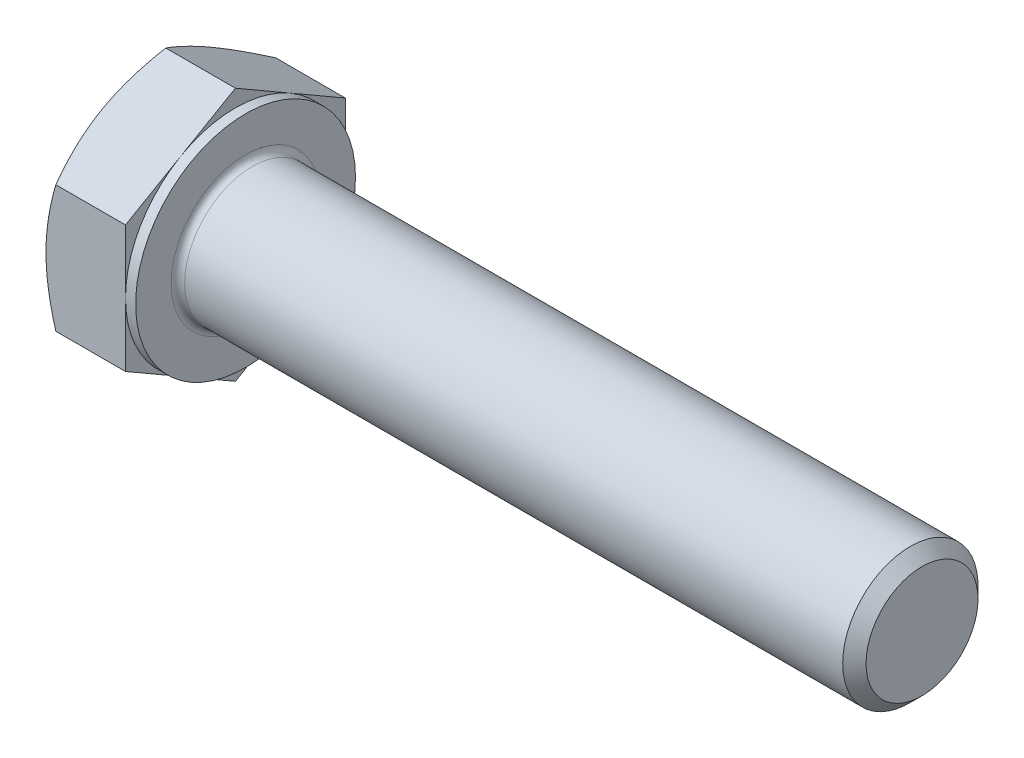
ISO-10303-21;
HEADER;
FILE_DESCRIPTION(('STEP AP214'),'2;1');
FILE_NAME('part.step','',(''),(''),'','','');
FILE_SCHEMA(('AUTOMOTIVE_DESIGN { 1 0 10303 214 1 1 1 1 }'));
ENDSEC;
DATA;
#1=APPLICATION_CONTEXT('core data for automotive mechanical design processes');
#2=APPLICATION_PROTOCOL_DEFINITION('international standard','automotive_design',2000,#1);
#3=PRODUCT_CONTEXT('',#1,'mechanical');
#4=PRODUCT('Part','Part','',(#3));
#5=PRODUCT_RELATED_PRODUCT_CATEGORY('part','',(#4));
#6=PRODUCT_DEFINITION_FORMATION('','',#4);
#7=PRODUCT_DEFINITION_CONTEXT('part definition',#1,'design');
#8=PRODUCT_DEFINITION('design','',#6,#7);
#9=PRODUCT_DEFINITION_SHAPE('','',#8);
#10=(LENGTH_UNIT() NAMED_UNIT(*) SI_UNIT(.MILLI.,.METRE.));
#11=(NAMED_UNIT(*) PLANE_ANGLE_UNIT() SI_UNIT($,.RADIAN.));
#12=(NAMED_UNIT(*) SI_UNIT($,.STERADIAN.) SOLID_ANGLE_UNIT());
#13=UNCERTAINTY_MEASURE_WITH_UNIT(LENGTH_MEASURE(1.E-05),#10,'distance_accuracy_value','');
#14=(GEOMETRIC_REPRESENTATION_CONTEXT(3) GLOBAL_UNCERTAINTY_ASSIGNED_CONTEXT((#13)) GLOBAL_UNIT_ASSIGNED_CONTEXT((#10,
#11,#12)) REPRESENTATION_CONTEXT('',''));
#15=CARTESIAN_POINT('',(0.,0.,0.));
#16=DIRECTION('',(0.,0.,1.));
#17=DIRECTION('',(1.,0.,0.));
#18=AXIS2_PLACEMENT_3D('',#15,#16,#17);
#19=CARTESIAN_POINT('',(5.3,7.50555349946514,0.));
#20=DIRECTION('',(1.,0.,0.));
#21=DIRECTION('',(0.,0.,-1.));
#22=AXIS2_PLACEMENT_3D('',#19,#20,#21);
#23=PLANE('',#22);
#24=CARTESIAN_POINT('',(5.3,0.,0.));
#25=DIRECTION('',(1.,0.,0.));
#26=DIRECTION('',(0.,0.,-1.));
#27=AXIS2_PLACEMENT_3D('',#24,#25,#26);
#28=CIRCLE('',#27,4.4);
#29=CARTESIAN_POINT('',(5.3,0.,-4.4));
#30=VERTEX_POINT('',#29);
#31=EDGE_CURVE('E44',#30,#30,#28,.F.);
#32=ORIENTED_EDGE('',*,*,#31,.T.);
#33=EDGE_LOOP('',(#32));
#34=FACE_BOUND('',#33,.T.);
#35=CARTESIAN_POINT('',(5.3,0.,0.));
#36=DIRECTION('',(1.,0.,0.));
#37=DIRECTION('',(0.,0.,-1.));
#38=AXIS2_PLACEMENT_3D('',#35,#36,#37);
#39=CIRCLE('',#38,6.5);
#40=CARTESIAN_POINT('',(5.3,0.,-6.5));
#41=VERTEX_POINT('',#40);
#42=EDGE_CURVE('E301',#41,#41,#39,.T.);
#43=ORIENTED_EDGE('',*,*,#42,.T.);
#44=EDGE_LOOP('',(#43));
#45=FACE_BOUND('',#44,.T.);
#46=ADVANCED_FACE('F36',(#34,#45),#23,.T.);
#47=CARTESIAN_POINT('',(0.,0.,0.));
#48=DIRECTION('',(-1.,0.,0.));
#49=DIRECTION('',(0.,0.,1.));
#50=AXIS2_PLACEMENT_3D('',#47,#48,#49);
#51=CYLINDRICAL_SURFACE('',#50,4.);
#52=CARTESIAN_POINT('',(5.7,0.,0.));
#53=DIRECTION('',(1.,0.,0.));
#54=DIRECTION('',(0.,0.,-1.));
#55=AXIS2_PLACEMENT_3D('',#52,#53,#54);
#56=CIRCLE('',#55,4.);
#57=CARTESIAN_POINT('',(5.7,0.,-4.));
#58=VERTEX_POINT('',#57);
#59=EDGE_CURVE('E11',#58,#58,#56,.T.);
#60=ORIENTED_EDGE('',*,*,#59,.T.);
#61=EDGE_LOOP('',(#60));
#62=FACE_BOUND('',#61,.T.);
#63=CARTESIAN_POINT('',(44.6095,0.,0.));
#64=DIRECTION('',(-1.,0.,0.));
#65=DIRECTION('',(0.,0.,1.));
#66=AXIS2_PLACEMENT_3D('',#63,#64,#65);
#67=CIRCLE('',#66,4.);
#68=CARTESIAN_POINT('',(44.6095,0.,4.));
#69=VERTEX_POINT('',#68);
#70=EDGE_CURVE('E280',#69,#69,#67,.T.);
#71=ORIENTED_EDGE('',*,*,#70,.T.);
#72=EDGE_LOOP('',(#71));
#73=FACE_BOUND('',#72,.T.);
#74=ADVANCED_FACE('F254',(#62,#73),#51,.T.);
#75=CARTESIAN_POINT('',(45.3,0.,0.));
#76=DIRECTION('',(-1.,0.,0.));
#77=DIRECTION('',(0.,0.,1.));
#78=AXIS2_PLACEMENT_3D('',#75,#76,#77);
#79=CONICAL_SURFACE('',#78,3.3095,0.785398163397436);
#80=ORIENTED_EDGE('',*,*,#70,.F.);
#81=EDGE_LOOP('',(#80));
#82=FACE_BOUND('',#81,.T.);
#83=CARTESIAN_POINT('',(45.3,0.,0.));
#84=DIRECTION('',(-1.,0.,0.));
#85=DIRECTION('',(0.,0.,1.));
#86=AXIS2_PLACEMENT_3D('',#83,#84,#85);
#87=CIRCLE('',#86,3.3095);
#88=CARTESIAN_POINT('',(45.3,0.,3.3095));
#89=VERTEX_POINT('',#88);
#90=EDGE_CURVE('E278',#89,#89,#87,.T.);
#91=ORIENTED_EDGE('',*,*,#90,.T.);
#92=EDGE_LOOP('',(#91));
#93=FACE_BOUND('',#92,.T.);
#94=ADVANCED_FACE('F259',(#82,#93),#79,.T.);
#95=CARTESIAN_POINT('',(45.3,0.,0.));
#96=DIRECTION('',(-1.,0.,0.));
#97=DIRECTION('',(0.,0.,1.));
#98=AXIS2_PLACEMENT_3D('',#95,#96,#97);
#99=PLANE('',#98);
#100=ORIENTED_EDGE('',*,*,#90,.F.);
#101=EDGE_LOOP('',(#100));
#102=FACE_BOUND('',#101,.T.);
#103=ADVANCED_FACE('F266',(#102),#99,.F.);
#104=CARTESIAN_POINT('',(4.7,6.5,0.));
#105=DIRECTION('',(1.,0.,0.));
#106=DIRECTION('',(0.,0.,-1.));
#107=AXIS2_PLACEMENT_3D('',#104,#105,#106);
#108=PLANE('',#107);
#109=DIRECTION('',(0.,0.500000000000001,0.866025403784438));
#110=VECTOR('',#109,1.);
#111=CARTESIAN_POINT('',(4.7,3.75277674973256,-6.5));
#112=LINE('',#111,#110);
#113=CARTESIAN_POINT('',(4.7,3.75277674973256,-6.5));
#114=VERTEX_POINT('',#113);
#115=CARTESIAN_POINT('',(4.7,5.62916512459885,-3.25000000000001));
#116=VERTEX_POINT('',#115);
#117=EDGE_CURVE('E168',#114,#116,#112,.T.);
#118=ORIENTED_EDGE('',*,*,#117,.T.);
#119=CARTESIAN_POINT('',(4.7,0.,0.));
#120=DIRECTION('',(-1.,0.,0.));
#121=DIRECTION('',(0.,0.,1.));
#122=AXIS2_PLACEMENT_3D('',#119,#120,#121);
#123=CIRCLE('',#122,6.5);
#124=CARTESIAN_POINT('',(4.7,0.,-6.5));
#125=VERTEX_POINT('',#124);
#126=EDGE_CURVE('E51',#116,#125,#123,.T.);
#127=ORIENTED_EDGE('',*,*,#126,.T.);
#128=DIRECTION('',(0.,1.,0.));
#129=VECTOR('',#128,1.);
#130=CARTESIAN_POINT('',(4.7,3.75277674973256,-6.5));
#131=LINE('',#130,#129);
#132=EDGE_CURVE('E304',#125,#114,#131,.T.);
#133=ORIENTED_EDGE('',*,*,#132,.T.);
#134=EDGE_LOOP('',(#118,#127,#133));
#135=FACE_BOUND('',#134,.T.);
#136=ADVANCED_FACE('F269',(#135),#108,.T.);
#137=CARTESIAN_POINT('',(4.7,7.50555349946514,0.));
#138=VERTEX_POINT('',#137);
#139=EDGE_CURVE('E166',#116,#138,#112,.T.);
#140=ORIENTED_EDGE('',*,*,#139,.T.);
#141=DIRECTION('',(0.,-0.500000000000001,0.866025403784438));
#142=VECTOR('',#141,1.);
#143=CARTESIAN_POINT('',(4.7,7.50555349946514,0.));
#144=LINE('',#143,#142);
#145=CARTESIAN_POINT('',(4.7,5.62916512459885,3.25000000000001));
#146=VERTEX_POINT('',#145);
#147=EDGE_CURVE('E165',#138,#146,#144,.T.);
#148=ORIENTED_EDGE('',*,*,#147,.T.);
#149=EDGE_CURVE('E154',#146,#116,#123,.T.);
#150=ORIENTED_EDGE('',*,*,#149,.T.);
#151=EDGE_LOOP('',(#140,#148,#150));
#152=FACE_BOUND('',#151,.T.);
#153=ADVANCED_FACE('F274',(#152),#108,.T.);
#154=CARTESIAN_POINT('',(4.7,3.75277674973256,6.5));
#155=VERTEX_POINT('',#154);
#156=EDGE_CURVE('E133',#146,#155,#144,.T.);
#157=ORIENTED_EDGE('',*,*,#156,.T.);
#158=DIRECTION('',(0.,-1.,0.));
#159=VECTOR('',#158,1.);
#160=CARTESIAN_POINT('',(4.7,3.75277674973256,6.5));
#161=LINE('',#160,#159);
#162=CARTESIAN_POINT('',(4.7,0.,6.5));
#163=VERTEX_POINT('',#162);
#164=EDGE_CURVE('E127',#155,#163,#161,.T.);
#165=ORIENTED_EDGE('',*,*,#164,.T.);
#166=EDGE_CURVE('E131',#163,#146,#123,.T.);
#167=ORIENTED_EDGE('',*,*,#166,.T.);
#168=EDGE_LOOP('',(#157,#165,#167));
#169=FACE_BOUND('',#168,.T.);
#170=ADVANCED_FACE('F129',(#169),#108,.T.);
#171=CARTESIAN_POINT('',(4.7,-3.75277674973256,6.5));
#172=VERTEX_POINT('',#171);
#173=EDGE_CURVE('E137',#163,#172,#161,.T.);
#174=ORIENTED_EDGE('',*,*,#173,.T.);
#175=DIRECTION('',(0.,-0.500000000000002,-0.866025403784437));
#176=VECTOR('',#175,1.);
#177=CARTESIAN_POINT('',(4.7,-7.50555349946515,0.));
#178=LINE('',#177,#176);
#179=CARTESIAN_POINT('',(4.7,-5.62916512459884,3.25000000000001));
#180=VERTEX_POINT('',#179);
#181=EDGE_CURVE('E144',#172,#180,#178,.T.);
#182=ORIENTED_EDGE('',*,*,#181,.T.);
#183=EDGE_CURVE('E141',#180,#163,#123,.T.);
#184=ORIENTED_EDGE('',*,*,#183,.T.);
#185=EDGE_LOOP('',(#174,#182,#184));
#186=FACE_BOUND('',#185,.T.);
#187=ADVANCED_FACE('F142',(#186),#108,.T.);
#188=CARTESIAN_POINT('',(4.7,-7.50555349946515,0.));
#189=VERTEX_POINT('',#188);
#190=EDGE_CURVE('E160',#180,#189,#178,.T.);
#191=ORIENTED_EDGE('',*,*,#190,.T.);
#192=DIRECTION('',(0.,0.500000000000001,-0.866025403784438));
#193=VECTOR('',#192,1.);
#194=CARTESIAN_POINT('',(4.7,-3.75277674973258,-6.5));
#195=LINE('',#194,#193);
#196=CARTESIAN_POINT('',(4.7,-5.62916512459885,-3.25000000000001));
#197=VERTEX_POINT('',#196);
#198=EDGE_CURVE('E342',#189,#197,#195,.T.);
#199=ORIENTED_EDGE('',*,*,#198,.T.);
#200=EDGE_CURVE('E148',#197,#180,#123,.T.);
#201=ORIENTED_EDGE('',*,*,#200,.T.);
#202=EDGE_LOOP('',(#191,#199,#201));
#203=FACE_BOUND('',#202,.T.);
#204=ADVANCED_FACE('F343',(#203),#108,.T.);
#205=CARTESIAN_POINT('',(4.7,-3.75277674973258,-6.5));
#206=VERTEX_POINT('',#205);
#207=EDGE_CURVE('E155',#197,#206,#195,.T.);
#208=ORIENTED_EDGE('',*,*,#207,.T.);
#209=EDGE_CURVE('E305',#206,#125,#131,.T.);
#210=ORIENTED_EDGE('',*,*,#209,.T.);
#211=EDGE_CURVE('E312',#125,#197,#123,.T.);
#212=ORIENTED_EDGE('',*,*,#211,.T.);
#213=EDGE_LOOP('',(#208,#210,#212));
#214=FACE_BOUND('',#213,.T.);
#215=ADVANCED_FACE('F275',(#214),#108,.T.);
#216=CARTESIAN_POINT('',(0.,0.,0.));
#217=DIRECTION('',(-1.,0.,0.));
#218=DIRECTION('',(0.,0.,1.));
#219=AXIS2_PLACEMENT_3D('',#216,#217,#218);
#220=CYLINDRICAL_SURFACE('',#219,6.5);
#221=ORIENTED_EDGE('',*,*,#126,.F.);
#222=ORIENTED_EDGE('',*,*,#149,.F.);
#223=ORIENTED_EDGE('',*,*,#166,.F.);
#224=ORIENTED_EDGE('',*,*,#183,.F.);
#225=ORIENTED_EDGE('',*,*,#200,.F.);
#226=ORIENTED_EDGE('',*,*,#211,.F.);
#227=EDGE_LOOP('',(#221,#222,#223,#224,#225,#226));
#228=FACE_BOUND('',#227,.T.);
#229=ORIENTED_EDGE('',*,*,#42,.F.);
#230=EDGE_LOOP('',(#229));
#231=FACE_BOUND('',#230,.T.);
#232=ADVANCED_FACE('F151',(#228,#231),#220,.T.);
#233=CARTESIAN_POINT('',(0.,7.50555349946514,0.));
#234=DIRECTION('',(1.,0.,0.));
#235=DIRECTION('',(0.,0.,-1.));
#236=AXIS2_PLACEMENT_3D('',#233,#234,#235);
#237=PLANE('',#236);
#238=CARTESIAN_POINT('',(0.,0.,0.));
#239=DIRECTION('',(1.,0.,0.));
#240=DIRECTION('',(0.,0.,-1.));
#241=AXIS2_PLACEMENT_3D('',#238,#239,#240);
#242=CIRCLE('',#241,6.5);
#243=CARTESIAN_POINT('',(0.,0.,-6.5));
#244=VERTEX_POINT('',#243);
#245=CARTESIAN_POINT('',(0.,5.62916512459885,-3.25000000000001));
#246=VERTEX_POINT('',#245);
#247=EDGE_CURVE('E300',#244,#246,#242,.T.);
#248=ORIENTED_EDGE('',*,*,#247,.F.);
#249=CARTESIAN_POINT('',(0.,-5.62916512459885,-3.25));
#250=VERTEX_POINT('',#249);
#251=EDGE_CURVE('E296',#250,#244,#242,.T.);
#252=ORIENTED_EDGE('',*,*,#251,.F.);
#253=CARTESIAN_POINT('',(0.,-5.62916512459884,3.25000000000001));
#254=VERTEX_POINT('',#253);
#255=EDGE_CURVE('E299',#254,#250,#242,.T.);
#256=ORIENTED_EDGE('',*,*,#255,.F.);
#257=CARTESIAN_POINT('',(0.,0.,6.5));
#258=VERTEX_POINT('',#257);
#259=EDGE_CURVE('E335',#258,#254,#242,.T.);
#260=ORIENTED_EDGE('',*,*,#259,.F.);
#261=CARTESIAN_POINT('',(0.,0.,0.));
#262=DIRECTION('',(-1.,0.,0.));
#263=DIRECTION('',(0.,0.,1.));
#264=AXIS2_PLACEMENT_3D('',#261,#262,#263);
#265=CIRCLE('',#264,6.5);
#266=CARTESIAN_POINT('',(0.,5.62916512459885,3.25000000000001));
#267=VERTEX_POINT('',#266);
#268=EDGE_CURVE('E169',#258,#267,#265,.T.);
#269=ORIENTED_EDGE('',*,*,#268,.T.);
#270=EDGE_CURVE('E358',#246,#267,#242,.T.);
#271=ORIENTED_EDGE('',*,*,#270,.F.);
#272=EDGE_LOOP('',(#248,#252,#256,#260,#269,#271));
#273=FACE_BOUND('',#272,.T.);
#274=ADVANCED_FACE('F200',(#273),#237,.F.);
#275=CARTESIAN_POINT('',(0.,0.,0.));
#276=DIRECTION('',(1.,0.,0.));
#277=DIRECTION('',(0.,0.,-1.));
#278=AXIS2_PLACEMENT_3D('',#275,#276,#277);
#279=CONICAL_SURFACE('',#278,6.5,1.0471975511966);
#280=CARTESIAN_POINT('',(0.580623251805866,3.75266127967873,6.5002));
#281=CARTESIAN_POINT('',(0.533004423075484,3.8351516191275,6.35732254094112));
#282=CARTESIAN_POINT('',(0.487546700602705,3.91794952254312,6.21391236546509));
#283=CARTESIAN_POINT('',(0.401548682023045,4.08421773795794,5.92592736868281));
#284=CARTESIAN_POINT('',(0.361010507228024,4.16768832359105,5.78135207342874));
#285=CARTESIAN_POINT('',(0.247571001123208,4.41943655294051,5.34531134947997));
#286=CARTESIAN_POINT('',(0.183047807128738,4.58870793403689,5.05212471715368));
#287=CARTESIAN_POINT('',(0.107386583547491,4.84201947708215,4.61337625445563));
#288=CARTESIAN_POINT('',(0.0858328564569873,4.92530276780316,4.46912536350531));
#289=CARTESIAN_POINT('',(0.049690314606119,5.09224566542477,4.17997178286191));
#290=CARTESIAN_POINT('',(0.0351008844596665,5.17590523841627,4.03506915190111));
#291=CARTESIAN_POINT('',(0.0132587525073469,5.34336968579964,3.74501222057168));
#292=CARTESIAN_POINT('',(0.00599772432210823,5.427174286676,3.59985839394579));
#293=CARTESIAN_POINT('',(-0.00103969741776798,5.59485627940483,3.30942466302505));
#294=CARTESIAN_POINT('',(-0.00081632218779477,5.6787336689286,3.16414476276365));
#295=CARTESIAN_POINT('',(0.0100834585151658,5.90853103021317,2.76612405757351));
#296=CARTESIAN_POINT('',(0.028381817869414,6.05437578112763,2.51351353897243));
#297=CARTESIAN_POINT('',(0.0864063414576757,6.34509659313135,2.00997032176432));
#298=CARTESIAN_POINT('',(0.126152338538245,6.48997163178545,1.75903939406692));
#299=CARTESIAN_POINT('',(0.22550590320215,6.78127752911039,1.25448277935568));
#300=CARTESIAN_POINT('',(0.285534425638028,6.92767163007068,1.00092075856409));
#301=CARTESIAN_POINT('',(0.42177499250987,7.21827667013277,0.497578064240955));
#302=CARTESIAN_POINT('',(0.497955034163595,7.36249133098589,0.247790944447036));
#303=CARTESIAN_POINT('',(0.580623251805869,7.50566896951898,-0.000200000000000043));
#304=B_SPLINE_CURVE_WITH_KNOTS('',3,(#280,#281,#282,#283,#284,#285,#286,#287,#288,#289,#290,
#291,#292,#293,#294,#295,#296,#297,#298,#299,#300,#301,#302,#303),.UNSPECIFIED.,.F.,.F.,(4,2,2,
2,2,2,2,2,2,2,2,4),(0.,0.515105052395588,1.03043143507524,2.06322554824262,2.56697389547996,
3.07067772176453,3.57380860368927,4.0769239424252,4.9527935470566,5.82947446853466,
6.72559912449737,7.61996451221046),.UNSPECIFIED.);
#305=CARTESIAN_POINT('',(0.580556583600765,7.50555349946514,0.));
#306=VERTEX_POINT('',#305);
#307=EDGE_CURVE('E220',#267,#306,#304,.T.);
#308=ORIENTED_EDGE('',*,*,#307,.T.);
#309=CARTESIAN_POINT('',(0.580623251805869,7.50566896951898,0.000200000000000058));
#310=CARTESIAN_POINT('',(0.533004423075487,7.4231786300702,-0.14267745905888));
#311=CARTESIAN_POINT('',(0.487546700602708,7.34038072665458,-0.286087634534913));
#312=CARTESIAN_POINT('',(0.401548682023048,7.17411251123976,-0.574072631317195));
#313=CARTESIAN_POINT('',(0.361010507228027,7.09064192560665,-0.718647926571264));
#314=CARTESIAN_POINT('',(0.24757100112321,6.83889369625719,-1.15468865052003));
#315=CARTESIAN_POINT('',(0.18304780712874,6.66962231516081,-1.44787528284632));
#316=CARTESIAN_POINT('',(0.107386583547492,6.41631077211555,-1.88662374554437));
#317=CARTESIAN_POINT('',(0.0858328564569873,6.33302748139454,-2.03087463649469));
#318=CARTESIAN_POINT('',(0.0496903146061189,6.16608458377293,-2.32002821713809));
#319=CARTESIAN_POINT('',(0.0351008844596667,6.08242501078143,-2.46493084809889));
#320=CARTESIAN_POINT('',(0.0132587525073468,5.91496056339806,-2.75498777942832));
#321=CARTESIAN_POINT('',(0.00599772432210739,5.8311559625217,-2.90014160605421));
#322=CARTESIAN_POINT('',(-0.00103969741776939,5.66347396979287,-3.19057533697495));
#323=CARTESIAN_POINT('',(-0.000816322187796096,5.5795965802691,-3.33585523723636));
#324=CARTESIAN_POINT('',(0.0100834585151643,5.34979921898453,-3.73387594242649));
#325=CARTESIAN_POINT('',(0.028381817869412,5.20395446807007,-3.98648646102757));
#326=CARTESIAN_POINT('',(0.0864063414576732,4.91323365606635,-4.49002967823568));
#327=CARTESIAN_POINT('',(0.126152338538243,4.76835861741225,-4.74096060593308));
#328=CARTESIAN_POINT('',(0.225505903202147,4.47705272008731,-5.24551722064432));
#329=CARTESIAN_POINT('',(0.285534425638024,4.33065861912702,-5.49907924143591));
#330=CARTESIAN_POINT('',(0.421774992509865,4.04005357906493,-6.00242193575904));
#331=CARTESIAN_POINT('',(0.497955034163589,3.89583891821181,-6.25220905555296));
#332=CARTESIAN_POINT('',(0.580623251805864,3.75266127967872,-6.5002));
#333=B_SPLINE_CURVE_WITH_KNOTS('',3,(#309,#310,#311,#312,#313,#314,#315,#316,#317,#318,#319,
#320,#321,#322,#323,#324,#325,#326,#327,#328,#329,#330,#331,#332),.UNSPECIFIED.,.F.,.F.,(4,2,2,
2,2,2,2,2,2,2,2,4),(0.,0.515105052395587,1.03043143507525,2.06322554824262,2.56697389547996,
3.07067772176454,3.57380860368928,4.0769239424252,4.9527935470566,5.82947446853466,
6.72559912449737,7.61996451221046),.UNSPECIFIED.);
#334=EDGE_CURVE('E59',#306,#246,#333,.T.);
#335=ORIENTED_EDGE('',*,*,#334,.T.);
#336=ORIENTED_EDGE('',*,*,#270,.T.);
#337=EDGE_LOOP('',(#308,#335,#336));
#338=FACE_BOUND('',#337,.T.);
#339=ADVANCED_FACE('F359',(#338),#279,.T.);
#340=CARTESIAN_POINT('',(3.18835311563218,-10.1137456673369,6.5));
#341=CARTESIAN_POINT('',(3.05034773984571,-9.82952666268362,6.5));
#342=CARTESIAN_POINT('',(2.91365616465171,-9.5446586959737,6.5));
#343=CARTESIAN_POINT('',(2.64363899475029,-8.97327978009769,6.5));
#344=CARTESIAN_POINT('',(2.51031392437708,-8.68676858342198,6.5));
#345=CARTESIAN_POINT('',(2.2471047346358,-8.11029837800201,6.5));
#346=CARTESIAN_POINT('',(2.11724300420667,-7.82032911160931,6.5));
#347=CARTESIAN_POINT('',(1.86279082811121,-7.23809540985588,6.5));
#348=CARTESIAN_POINT('',(1.73820013539998,-6.94583108282377,6.5));
#349=CARTESIAN_POINT('',(1.49176685414526,-6.3490644093219,6.5));
#350=CARTESIAN_POINT('',(1.37014257629962,-6.04447142260091,6.5));
#351=CARTESIAN_POINT('',(1.13601865749049,-5.43173420932696,6.5));
#352=CARTESIAN_POINT('',(1.02352003549992,-5.12358959057325,6.5));
#353=CARTESIAN_POINT('',(0.810575368180001,-4.50382569763974,6.5));
#354=CARTESIAN_POINT('',(0.710105232251764,-4.19221478250844,6.5));
#355=CARTESIAN_POINT('',(0.524420166111966,-3.56452019194196,6.5));
#356=CARTESIAN_POINT('',(0.439200468182008,-3.248437947833,6.5));
#357=CARTESIAN_POINT('',(0.288524223393068,-2.61335465708693,6.5));
#358=CARTESIAN_POINT('',(0.222961865744181,-2.29437912058766,6.5));
#359=CARTESIAN_POINT('',(0.115312883140193,-1.65238219411907,6.5));
#360=CARTESIAN_POINT('',(0.0732239014810091,-1.32936121363906,6.5));
#361=CARTESIAN_POINT('',(0.0304887136492794,-0.845231171985975,6.5));
#362=CARTESIAN_POINT('',(0.0196493434374821,-0.684982209825922,6.5));
#363=CARTESIAN_POINT('',(0.00475298486802876,-0.364162349261904,6.5));
#364=CARTESIAN_POINT('',(0.000695882912927172,-0.203591456295117,6.5));
#365=CARTESIAN_POINT('',(-0.000531597192431328,0.1175774301276,6.5));
#366=CARTESIAN_POINT('',(0.00229809016385267,0.278175423826781,6.5));
#367=CARTESIAN_POINT('',(0.0147726845392773,0.599108972527034,6.5));
#368=CARTESIAN_POINT('',(0.0244179260292906,0.759444514261301,6.5));
#369=CARTESIAN_POINT('',(0.0554961939005615,1.14369946568681,6.5));
#370=CARTESIAN_POINT('',(0.0801030490102269,1.36736763010324,6.5));
#371=CARTESIAN_POINT('',(0.141246537396777,1.81305591275147,6.5));
#372=CARTESIAN_POINT('',(0.177784759549961,2.03507580745699,6.5));
#373=CARTESIAN_POINT('',(0.303360001243785,2.69839633393827,6.5));
#374=CARTESIAN_POINT('',(0.408335815043155,3.13672010332747,6.5));
#375=CARTESIAN_POINT('',(0.590564593006713,3.79232112874052,6.5));
#376=CARTESIAN_POINT('',(0.65631319884288,4.01299150829171,6.5));
#377=CARTESIAN_POINT('',(0.794681634048787,4.45218858961827,6.5));
#378=CARTESIAN_POINT('',(0.867301512962924,4.67071527592428,6.5));
#379=CARTESIAN_POINT('',(1.01824353836803,5.10569490203688,6.5));
#380=CARTESIAN_POINT('',(1.09656388214599,5.32214847315217,6.5));
#381=CARTESIAN_POINT('',(1.25798086145111,5.75325725721539,6.5));
#382=CARTESIAN_POINT('',(1.34107741015562,5.96791250277235,6.5));
#383=CARTESIAN_POINT('',(1.56029019561415,6.51888445883542,6.5));
#384=CARTESIAN_POINT('',(1.69936356644503,6.85402316761088,6.5));
#385=CARTESIAN_POINT('',(1.98501958064622,7.52109583887401,6.5));
#386=CARTESIAN_POINT('',(2.13160288757765,7.85302951508196,6.5));
#387=CARTESIAN_POINT('',(2.43059748021416,8.51437865467404,6.5));
#388=CARTESIAN_POINT('',(2.5830105757321,8.84379329733069,6.5));
#389=CARTESIAN_POINT('',(2.89234869350808,9.50047798633191,6.5));
#390=CARTESIAN_POINT('',(3.04927357195785,9.82774810062368,6.5));
#391=CARTESIAN_POINT('',(3.36692013106101,10.4809971970749,6.5));
#392=CARTESIAN_POINT('',(3.52764676467091,10.8069737662429,6.5));
#393=CARTESIAN_POINT('',(3.85198555530079,11.4574882896092,6.5));
#394=CARTESIAN_POINT('',(4.01559773098172,11.7820262344869,6.5));
#395=CARTESIAN_POINT('',(4.50986184978697,12.753746810957,6.5));
#396=CARTESIAN_POINT('',(4.84399997953393,13.399155592763,6.5));
#397=CARTESIAN_POINT('',(5.48575990240557,14.6239779286089,6.5));
#398=CARTESIAN_POINT('',(5.79279643346765,15.20369957558,6.5));
#399=CARTESIAN_POINT('',(6.41069188201846,16.361138263307,6.5));
#400=CARTESIAN_POINT('',(6.72155098984205,16.9388552023925,6.5));
#401=CARTESIAN_POINT('',(7.34519775412869,18.0910273551188,6.5));
#402=CARTESIAN_POINT('',(7.65797694142596,18.6654871601313,6.5));
#403=CARTESIAN_POINT('',(8.28574397126581,19.8131486199609,6.5));
#404=CARTESIAN_POINT('',(8.60073166267673,20.386350357412,6.5));
#405=CARTESIAN_POINT('',(8.91652967142033,20.9591024516605,6.5));
#406=B_SPLINE_CURVE_WITH_KNOTS('',3,(#340,#341,#342,#343,#344,#345,#346,#347,#348,#349,#350,
#351,#352,#353,#354,#355,#356,#357,#358,#359,#360,#361,#362,#363,#364,#365,#366,#367,#368,#369,
#370,#371,#372,#373,#374,#375,#376,#377,#378,#379,#380,#381,#382,#383,#384,#385,#386,#387,#388,
#389,#390,#391,#392,#393,#394,#395,#396,#397,#398,#399,#400,#401,#402,#403,#404,#405),
.UNSPECIFIED.,.F.,.F.,(4,2,2,2,2,2,2,2,2,2,2,2,2,2,2,2,2,2,2,2,2,2,2,2,2,2,2,2,2,2,2,2,4),(0.,
0.947868666637001,1.89588406470429,2.84900320910869,3.80207763278045,4.78589774049431,
5.7698275510146,6.75175256199404,7.7333700571013,8.70960474826445,9.68574140876309,
10.1674651045585,10.6491807317952,11.1309009410869,11.612644792267,12.2873175714037,
12.9620802320305,14.3123184370259,15.0030310333297,15.6937486103038,16.3842486961975,
17.074736234034,18.1631508671877,19.2516618366358,20.3405135130782,21.4293305219253,
22.5196540535909,23.6099846390268,25.7902468223404,27.7582608860787,29.7263733417655,
31.6886408583916,33.6507753794603),.UNSPECIFIED.);
#407=CARTESIAN_POINT('',(0.580556583600762,3.75277674973256,6.5));
#408=VERTEX_POINT('',#407);
#409=EDGE_CURVE('E234',#258,#408,#406,.T.);
#410=ORIENTED_EDGE('',*,*,#409,.T.);
#411=EDGE_CURVE('E233',#408,#267,#304,.T.);
#412=ORIENTED_EDGE('',*,*,#411,.T.);
#413=ORIENTED_EDGE('',*,*,#268,.F.);
#414=EDGE_LOOP('',(#410,#412,#413));
#415=FACE_BOUND('',#414,.T.);
#416=ADVANCED_FACE('F329',(#415),#279,.T.);
#417=CARTESIAN_POINT('',(0.580556583600761,-3.75277674973256,6.5));
#418=VERTEX_POINT('',#417);
#419=EDGE_CURVE('E281',#418,#258,#406,.T.);
#420=ORIENTED_EDGE('',*,*,#419,.T.);
#421=ORIENTED_EDGE('',*,*,#259,.T.);
#422=CARTESIAN_POINT('',(0.580623251805876,-7.50566896951899,-0.000200000000000038));
#423=CARTESIAN_POINT('',(0.533004423075494,-7.42317863007021,0.142677459058881));
#424=CARTESIAN_POINT('',(0.487546700602714,-7.34038072665459,0.286087634534913));
#425=CARTESIAN_POINT('',(0.401548682023053,-7.17411251123977,0.574072631317195));
#426=CARTESIAN_POINT('',(0.361010507228032,-7.09064192560666,0.718647926571264));
#427=CARTESIAN_POINT('',(0.247571001123215,-6.8388936962572,1.15468865052003));
#428=CARTESIAN_POINT('',(0.183047807128745,-6.66962231516082,1.44787528284632));
#429=CARTESIAN_POINT('',(0.107386583547496,-6.41631077211556,1.88662374554438));
#430=CARTESIAN_POINT('',(0.0858328564569921,-6.33302748139455,2.03087463649469));
#431=CARTESIAN_POINT('',(0.0496903146061233,-6.16608458377294,2.32002821713809));
#432=CARTESIAN_POINT('',(0.0351008844596709,-6.08242501078144,2.46493084809889));
#433=CARTESIAN_POINT('',(0.0132587525073508,-5.91496056339807,2.75498777942832));
#434=CARTESIAN_POINT('',(0.00599772432211139,-5.83115596252171,2.90014160605421));
#435=CARTESIAN_POINT('',(-0.00103969741776562,-5.66347396979287,3.19057533697495));
#436=CARTESIAN_POINT('',(-0.000816322187792552,-5.5795965802691,3.33585523723636));
#437=CARTESIAN_POINT('',(0.0100834585151674,-5.34979921898453,3.7338759424265));
#438=CARTESIAN_POINT('',(0.0283818178694149,-5.20395446807007,3.98648646102757));
#439=CARTESIAN_POINT('',(0.0864063414576758,-4.91323365606636,4.49002967823568));
#440=CARTESIAN_POINT('',(0.126152338538245,-4.76835861741226,4.74096060593308));
#441=CARTESIAN_POINT('',(0.225505903202149,-4.47705272008732,5.24551722064432));
#442=CARTESIAN_POINT('',(0.285534425638026,-4.33065861912702,5.49907924143591));
#443=CARTESIAN_POINT('',(0.421774992509868,-4.04005357906493,6.00242193575904));
#444=CARTESIAN_POINT('',(0.497955034163592,-3.89583891821181,6.25220905555296));
#445=CARTESIAN_POINT('',(0.580623251805865,-3.75266127967872,6.5002));
#446=B_SPLINE_CURVE_WITH_KNOTS('',3,(#422,#423,#424,#425,#426,#427,#428,#429,#430,#431,#432,
#433,#434,#435,#436,#437,#438,#439,#440,#441,#442,#443,#444,#445),.UNSPECIFIED.,.F.,.F.,(4,2,2,
2,2,2,2,2,2,2,2,4),(0.,0.515105052395589,1.03043143507525,2.06322554824263,2.56697389547997,
3.07067772176454,3.57380860368929,4.07692394242521,4.95279354705661,5.82947446853467,
6.72559912449737,7.61996451221047),.UNSPECIFIED.);
#447=EDGE_CURVE('E222',#254,#418,#446,.T.);
#448=ORIENTED_EDGE('',*,*,#447,.T.);
#449=EDGE_LOOP('',(#420,#421,#448));
#450=FACE_BOUND('',#449,.T.);
#451=ADVANCED_FACE('F189',(#450),#279,.T.);
#452=CARTESIAN_POINT('',(0.580556583600772,-7.50555349946515,0.));
#453=VERTEX_POINT('',#452);
#454=EDGE_CURVE('E214',#453,#254,#446,.T.);
#455=ORIENTED_EDGE('',*,*,#454,.T.);
#456=ORIENTED_EDGE('',*,*,#255,.T.);
#457=CARTESIAN_POINT('',(0.580623251805869,-3.75266127967874,-6.5002));
#458=CARTESIAN_POINT('',(0.533004423075487,-3.83515161912751,-6.35732254094112));
#459=CARTESIAN_POINT('',(0.487546700602708,-3.91794952254313,-6.21391236546509));
#460=CARTESIAN_POINT('',(0.401548682023048,-4.08421773795796,-5.9259273686828));
#461=CARTESIAN_POINT('',(0.361010507228027,-4.16768832359106,-5.78135207342873));
#462=CARTESIAN_POINT('',(0.247571001123211,-4.41943655294053,-5.34531134947996));
#463=CARTESIAN_POINT('',(0.183047807128742,-4.58870793403691,-5.05212471715368));
#464=CARTESIAN_POINT('',(0.107386583547495,-4.84201947708216,-4.61337625445562));
#465=CARTESIAN_POINT('',(0.0858328564569916,-4.92530276780317,-4.46912536350531));
#466=CARTESIAN_POINT('',(0.0496903146061235,-5.09224566542478,-4.17997178286191));
#467=CARTESIAN_POINT('',(0.0351008844596713,-5.17590523841629,-4.03506915190111));
#468=CARTESIAN_POINT('',(0.0132587525073522,-5.34336968579965,-3.74501222057168));
#469=CARTESIAN_POINT('',(0.00599772432211368,-5.42717428667601,-3.59985839394579));
#470=CARTESIAN_POINT('',(-0.00103969741776216,-5.59485627940485,-3.30942466302505));
#471=CARTESIAN_POINT('',(-0.000816322187788783,-5.67873366892861,-3.16414476276364));
#472=CARTESIAN_POINT('',(0.0100834585151722,-5.90853103021318,-2.7661240575735));
#473=CARTESIAN_POINT('',(0.0283818178694205,-6.05437578112765,-2.51351353897243));
#474=CARTESIAN_POINT('',(0.0864063414576828,-6.34509659313136,-2.00997032176432));
#475=CARTESIAN_POINT('',(0.126152338538253,-6.48997163178546,-1.75903939406692));
#476=CARTESIAN_POINT('',(0.225505903202158,-6.7812775291104,-1.25448277935568));
#477=CARTESIAN_POINT('',(0.285534425638035,-6.92767163007069,-1.00092075856409));
#478=CARTESIAN_POINT('',(0.421774992509877,-7.21827667013278,-0.497578064240955));
#479=CARTESIAN_POINT('',(0.497955034163601,-7.3624913309859,-0.247790944447036));
#480=CARTESIAN_POINT('',(0.580623251805876,-7.50566896951899,0.000199999999999512));
#481=B_SPLINE_CURVE_WITH_KNOTS('',3,(#457,#458,#459,#460,#461,#462,#463,#464,#465,#466,#467,
#468,#469,#470,#471,#472,#473,#474,#475,#476,#477,#478,#479,#480),.UNSPECIFIED.,.F.,.F.,(4,2,2,
2,2,2,2,2,2,2,2,4),(0.,0.515105052395588,1.03043143507525,2.06322554824262,2.56697389547997,
3.07067772176454,3.57380860368928,4.0769239424252,4.9527935470566,5.82947446853466,
6.72559912449736,7.61996451221046),.UNSPECIFIED.);
#482=EDGE_CURVE('E221',#250,#453,#481,.T.);
#483=ORIENTED_EDGE('',*,*,#482,.T.);
#484=EDGE_LOOP('',(#455,#456,#483));
#485=FACE_BOUND('',#484,.T.);
#486=ADVANCED_FACE('F357',(#485),#279,.T.);
#487=CARTESIAN_POINT('',(0.58055658360076,3.75277674973256,-6.5));
#488=VERTEX_POINT('',#487);
#489=EDGE_CURVE('E223',#246,#488,#333,.T.);
#490=ORIENTED_EDGE('',*,*,#489,.T.);
#491=CARTESIAN_POINT('',(3.18835311563219,-10.1137456673369,-6.5));
#492=CARTESIAN_POINT('',(3.05034773984572,-9.82952666268364,-6.5));
#493=CARTESIAN_POINT('',(2.91365616465172,-9.54465869597372,-6.5));
#494=CARTESIAN_POINT('',(2.64363899475029,-8.9732797800977,-6.5));
#495=CARTESIAN_POINT('',(2.51031392437709,-8.68676858342199,-6.5));
#496=CARTESIAN_POINT('',(2.24710473463581,-8.11029837800202,-6.5));
#497=CARTESIAN_POINT('',(2.11724300420667,-7.82032911160933,-6.5));
#498=CARTESIAN_POINT('',(1.86279082811121,-7.2380954098559,-6.5));
#499=CARTESIAN_POINT('',(1.73820013539999,-6.94583108282378,-6.5));
#500=CARTESIAN_POINT('',(1.49176685414526,-6.34906440932191,-6.5));
#501=CARTESIAN_POINT('',(1.37014257629962,-6.04447142260092,-6.5));
#502=CARTESIAN_POINT('',(1.13601865749049,-5.43173420932698,-6.5));
#503=CARTESIAN_POINT('',(1.02352003549993,-5.12358959057326,-6.5));
#504=CARTESIAN_POINT('',(0.810575368180005,-4.50382569763975,-6.5));
#505=CARTESIAN_POINT('',(0.710105232251767,-4.19221478250845,-6.5));
#506=CARTESIAN_POINT('',(0.524420166111968,-3.56452019194197,-6.5));
#507=CARTESIAN_POINT('',(0.439200468182011,-3.24843794783301,-6.5));
#508=CARTESIAN_POINT('',(0.288524223393071,-2.61335465708694,-6.5));
#509=CARTESIAN_POINT('',(0.222961865744182,-2.29437912058768,-6.5));
#510=CARTESIAN_POINT('',(0.115312883140194,-1.65238219411908,-6.5));
#511=CARTESIAN_POINT('',(0.0732239014810108,-1.32936121363908,-6.5));
#512=CARTESIAN_POINT('',(0.0304887136492798,-0.845231171985987,-6.5));
#513=CARTESIAN_POINT('',(0.0196493434374816,-0.684982209825934,-6.5));
#514=CARTESIAN_POINT('',(0.00475298486802777,-0.364162349261915,-6.5));
#515=CARTESIAN_POINT('',(0.000695882912926453,-0.203591456295128,-6.5));
#516=CARTESIAN_POINT('',(-0.000531597192432105,0.11757743012759,-6.5));
#517=CARTESIAN_POINT('',(0.00229809016385158,0.278175423826772,-6.5));
#518=CARTESIAN_POINT('',(0.0147726845392758,0.599108972527025,-6.5));
#519=CARTESIAN_POINT('',(0.024417926029289,0.759444514261292,-6.5));
#520=CARTESIAN_POINT('',(0.0554961939005595,1.1436994656868,-6.5));
#521=CARTESIAN_POINT('',(0.0801030490102248,1.36736763010323,-6.5));
#522=CARTESIAN_POINT('',(0.141246537396774,1.81305591275146,-6.5));
#523=CARTESIAN_POINT('',(0.177784759549958,2.03507580745698,-6.5));
#524=CARTESIAN_POINT('',(0.303360001243781,2.69839633393825,-6.5));
#525=CARTESIAN_POINT('',(0.40833581504315,3.13672010332745,-6.5));
#526=CARTESIAN_POINT('',(0.590564593006708,3.79232112874051,-6.5));
#527=CARTESIAN_POINT('',(0.656313198842875,4.0129915082917,-6.5));
#528=CARTESIAN_POINT('',(0.794681634048782,4.45218858961826,-6.5));
#529=CARTESIAN_POINT('',(0.867301512962918,4.67071527592427,-6.5));
#530=CARTESIAN_POINT('',(1.01824353836802,5.10569490203687,-6.5));
#531=CARTESIAN_POINT('',(1.09656388214598,5.32214847315216,-6.5));
#532=CARTESIAN_POINT('',(1.2579808614511,5.75325725721537,-6.5));
#533=CARTESIAN_POINT('',(1.34107741015562,5.96791250277233,-6.5));
#534=CARTESIAN_POINT('',(1.56029019561415,6.5188844588354,-6.5));
#535=CARTESIAN_POINT('',(1.69936356644502,6.85402316761086,-6.5));
#536=CARTESIAN_POINT('',(1.98501958064621,7.52109583887399,-6.5));
#537=CARTESIAN_POINT('',(2.13160288757764,7.85302951508194,-6.5));
#538=CARTESIAN_POINT('',(2.43059748021415,8.51437865467402,-6.5));
#539=CARTESIAN_POINT('',(2.58301057573209,8.84379329733066,-6.5));
#540=CARTESIAN_POINT('',(2.89234869350807,9.50047798633189,-6.5));
#541=CARTESIAN_POINT('',(3.04927357195784,9.82774810062366,-6.5));
#542=CARTESIAN_POINT('',(3.366920131061,10.4809971970749,-6.5));
#543=CARTESIAN_POINT('',(3.5276467646709,10.8069737662429,-6.5));
#544=CARTESIAN_POINT('',(3.85198555530078,11.4574882896092,-6.5));
#545=CARTESIAN_POINT('',(4.01559773098171,11.7820262344869,-6.5));
#546=CARTESIAN_POINT('',(4.50986184978696,12.7537468109569,-6.5));
#547=CARTESIAN_POINT('',(4.84399997953392,13.399155592763,-6.5));
#548=CARTESIAN_POINT('',(5.48575990240556,14.6239779286088,-6.5));
#549=CARTESIAN_POINT('',(5.79279643346764,15.20369957558,-6.5));
#550=CARTESIAN_POINT('',(6.41069188201845,16.361138263307,-6.5));
#551=CARTESIAN_POINT('',(6.72155098984204,16.9388552023925,-6.5));
#552=CARTESIAN_POINT('',(7.34519775412868,18.0910273551188,-6.5));
#553=CARTESIAN_POINT('',(7.65797694142596,18.6654871601313,-6.5));
#554=CARTESIAN_POINT('',(8.28574397126581,19.8131486199609,-6.5));
#555=CARTESIAN_POINT('',(8.60073166267673,20.386350357412,-6.5));
#556=CARTESIAN_POINT('',(8.91652967142033,20.9591024516605,-6.5));
#557=B_SPLINE_CURVE_WITH_KNOTS('',3,(#491,#492,#493,#494,#495,#496,#497,#498,#499,#500,#501,
#502,#503,#504,#505,#506,#507,#508,#509,#510,#511,#512,#513,#514,#515,#516,#517,#518,#519,#520,
#521,#522,#523,#524,#525,#526,#527,#528,#529,#530,#531,#532,#533,#534,#535,#536,#537,#538,#539,
#540,#541,#542,#543,#544,#545,#546,#547,#548,#549,#550,#551,#552,#553,#554,#555,#556),
.UNSPECIFIED.,.F.,.F.,(4,2,2,2,2,2,2,2,2,2,2,2,2,2,2,2,2,2,2,2,2,2,2,2,2,2,2,2,2,2,2,2,4),(0.,
0.947868666637002,1.89588406470429,2.8490032091087,3.80207763278045,4.78589774049431,
5.7698275510146,6.75175256199404,7.7333700571013,8.70960474826445,9.6857414087631,
10.1674651045585,10.6491807317952,11.1309009410869,11.612644792267,12.2873175714037,
12.9620802320305,14.3123184370259,15.0030310333297,15.6937486103038,16.3842486961975,
17.074736234034,18.1631508671877,19.2516618366357,20.3405135130782,21.4293305219253,
22.5196540535909,23.6099846390268,25.7902468223404,27.7582608860787,29.7263733417655,
31.6886408583916,33.6507753794603),.UNSPECIFIED.);
#558=EDGE_CURVE('E181',#488,#244,#557,.F.);
#559=ORIENTED_EDGE('',*,*,#558,.T.);
#560=ORIENTED_EDGE('',*,*,#247,.T.);
#561=EDGE_LOOP('',(#490,#559,#560));
#562=FACE_BOUND('',#561,.T.);
#563=ADVANCED_FACE('F354',(#562),#279,.T.);
#564=CARTESIAN_POINT('',(0.580556583600764,-3.75277674973258,-6.5));
#565=VERTEX_POINT('',#564);
#566=EDGE_CURVE('E182',#565,#250,#481,.T.);
#567=ORIENTED_EDGE('',*,*,#566,.T.);
#568=ORIENTED_EDGE('',*,*,#251,.T.);
#569=EDGE_CURVE('E172',#244,#565,#557,.F.);
#570=ORIENTED_EDGE('',*,*,#569,.T.);
#571=EDGE_LOOP('',(#567,#568,#570));
#572=FACE_BOUND('',#571,.T.);
#573=ADVANCED_FACE('F198',(#572),#279,.T.);
#574=CARTESIAN_POINT('',(5.3,3.75277674973256,-6.5));
#575=DIRECTION('',(0.,0.,1.));
#576=DIRECTION('',(1.,0.,0.));
#577=AXIS2_PLACEMENT_3D('',#574,#575,#576);
#578=PLANE('',#577);
#579=ORIENTED_EDGE('',*,*,#209,.F.);
#580=DIRECTION('',(-1.,0.,0.));
#581=VECTOR('',#580,1.);
#582=CARTESIAN_POINT('',(5.3,-3.75277674973258,-6.5));
#583=LINE('',#582,#581);
#584=EDGE_CURVE('E287',#206,#565,#583,.T.);
#585=ORIENTED_EDGE('',*,*,#584,.T.);
#586=ORIENTED_EDGE('',*,*,#569,.F.);
#587=ORIENTED_EDGE('',*,*,#558,.F.);
#588=DIRECTION('',(-1.,0.,0.));
#589=VECTOR('',#588,1.);
#590=CARTESIAN_POINT('',(5.3,3.75277674973256,-6.5));
#591=LINE('',#590,#589);
#592=EDGE_CURVE('E283',#114,#488,#591,.T.);
#593=ORIENTED_EDGE('',*,*,#592,.F.);
#594=ORIENTED_EDGE('',*,*,#132,.F.);
#595=EDGE_LOOP('',(#579,#585,#586,#587,#593,#594));
#596=FACE_BOUND('',#595,.T.);
#597=ADVANCED_FACE('F193',(#596),#578,.F.);
#598=CARTESIAN_POINT('',(5.3,-3.75277674973258,-6.5));
#599=DIRECTION('',(0.,0.866025403784438,0.500000000000001));
#600=DIRECTION('',(0.,-0.500000000000001,0.866025403784438));
#601=AXIS2_PLACEMENT_3D('',#598,#599,#600);
#602=PLANE('',#601);
#603=ORIENTED_EDGE('',*,*,#198,.F.);
#604=DIRECTION('',(-1.,0.,0.));
#605=VECTOR('',#604,1.);
#606=CARTESIAN_POINT('',(5.3,-7.50555349946515,0.));
#607=LINE('',#606,#605);
#608=EDGE_CURVE('E289',#189,#453,#607,.T.);
#609=ORIENTED_EDGE('',*,*,#608,.T.);
#610=ORIENTED_EDGE('',*,*,#482,.F.);
#611=ORIENTED_EDGE('',*,*,#566,.F.);
#612=ORIENTED_EDGE('',*,*,#584,.F.);
#613=ORIENTED_EDGE('',*,*,#207,.F.);
#614=EDGE_LOOP('',(#603,#609,#610,#611,#612,#613));
#615=FACE_BOUND('',#614,.T.);
#616=ADVANCED_FACE('F197',(#615),#602,.F.);
#617=CARTESIAN_POINT('',(5.3,-7.50555349946515,0.));
#618=DIRECTION('',(0.,0.866025403784438,-0.500000000000002));
#619=DIRECTION('',(0.,0.500000000000002,0.866025403784437));
#620=AXIS2_PLACEMENT_3D('',#617,#618,#619);
#621=PLANE('',#620);
#622=ORIENTED_EDGE('',*,*,#181,.F.);
#623=DIRECTION('',(-1.,0.,0.));
#624=VECTOR('',#623,1.);
#625=CARTESIAN_POINT('',(5.3,-3.75277674973256,6.5));
#626=LINE('',#625,#624);
#627=EDGE_CURVE('E159',#172,#418,#626,.T.);
#628=ORIENTED_EDGE('',*,*,#627,.T.);
#629=ORIENTED_EDGE('',*,*,#447,.F.);
#630=ORIENTED_EDGE('',*,*,#454,.F.);
#631=ORIENTED_EDGE('',*,*,#608,.F.);
#632=ORIENTED_EDGE('',*,*,#190,.F.);
#633=EDGE_LOOP('',(#622,#628,#629,#630,#631,#632));
#634=FACE_BOUND('',#633,.T.);
#635=ADVANCED_FACE('F205',(#634),#621,.F.);
#636=CARTESIAN_POINT('',(5.3,3.75277674973256,6.5));
#637=DIRECTION('',(0.,0.,-1.));
#638=DIRECTION('',(0.,1.,0.));
#639=AXIS2_PLACEMENT_3D('',#636,#637,#638);
#640=PLANE('',#639);
#641=ORIENTED_EDGE('',*,*,#164,.F.);
#642=DIRECTION('',(-1.,0.,0.));
#643=VECTOR('',#642,1.);
#644=CARTESIAN_POINT('',(5.3,3.75277674973256,6.5));
#645=LINE('',#644,#643);
#646=EDGE_CURVE('E292',#155,#408,#645,.T.);
#647=ORIENTED_EDGE('',*,*,#646,.T.);
#648=ORIENTED_EDGE('',*,*,#409,.F.);
#649=ORIENTED_EDGE('',*,*,#419,.F.);
#650=ORIENTED_EDGE('',*,*,#627,.F.);
#651=ORIENTED_EDGE('',*,*,#173,.F.);
#652=EDGE_LOOP('',(#641,#647,#648,#649,#650,#651));
#653=FACE_BOUND('',#652,.T.);
#654=ADVANCED_FACE('F157',(#653),#640,.F.);
#655=CARTESIAN_POINT('',(5.3,7.50555349946514,0.));
#656=DIRECTION('',(0.,-0.866025403784438,-0.500000000000001));
#657=DIRECTION('',(0.,0.500000000000001,-0.866025403784438));
#658=AXIS2_PLACEMENT_3D('',#655,#656,#657);
#659=PLANE('',#658);
#660=ORIENTED_EDGE('',*,*,#147,.F.);
#661=DIRECTION('',(-1.,0.,0.));
#662=VECTOR('',#661,1.);
#663=CARTESIAN_POINT('',(5.3,7.50555349946514,0.));
#664=LINE('',#663,#662);
#665=EDGE_CURVE('E294',#138,#306,#664,.T.);
#666=ORIENTED_EDGE('',*,*,#665,.T.);
#667=ORIENTED_EDGE('',*,*,#307,.F.);
#668=ORIENTED_EDGE('',*,*,#411,.F.);
#669=ORIENTED_EDGE('',*,*,#646,.F.);
#670=ORIENTED_EDGE('',*,*,#156,.F.);
#671=EDGE_LOOP('',(#660,#666,#667,#668,#669,#670));
#672=FACE_BOUND('',#671,.T.);
#673=ADVANCED_FACE('F240',(#672),#659,.F.);
#674=CARTESIAN_POINT('',(5.3,3.75277674973256,-6.5));
#675=DIRECTION('',(0.,-0.866025403784438,0.500000000000001));
#676=DIRECTION('',(0.,-0.500000000000001,-0.866025403784438));
#677=AXIS2_PLACEMENT_3D('',#674,#675,#676);
#678=PLANE('',#677);
#679=ORIENTED_EDGE('',*,*,#117,.F.);
#680=ORIENTED_EDGE('',*,*,#592,.T.);
#681=ORIENTED_EDGE('',*,*,#489,.F.);
#682=ORIENTED_EDGE('',*,*,#334,.F.);
#683=ORIENTED_EDGE('',*,*,#665,.F.);
#684=ORIENTED_EDGE('',*,*,#139,.F.);
#685=EDGE_LOOP('',(#679,#680,#681,#682,#683,#684));
#686=FACE_BOUND('',#685,.T.);
#687=ADVANCED_FACE('F243',(#686),#678,.F.);
#688=CARTESIAN_POINT('',(5.7,0.,0.));
#689=DIRECTION('',(1.,0.,0.));
#690=DIRECTION('',(0.,0.,-1.));
#691=AXIS2_PLACEMENT_3D('',#688,#689,#690);
#692=TOROIDAL_SURFACE('',#691,4.4,0.4);
#693=ORIENTED_EDGE('',*,*,#59,.F.);
#694=EDGE_LOOP('',(#693));
#695=FACE_BOUND('',#694,.T.);
#696=ORIENTED_EDGE('',*,*,#31,.F.);
#697=EDGE_LOOP('',(#696));
#698=FACE_BOUND('',#697,.T.);
#699=ADVANCED_FACE('F38',(#695,#698),#692,.F.);
#700=CLOSED_SHELL('',(#46,#74,#94,#103,#136,#153,#170,#187,#204,#215,#232,#274,#339,#416,#451,
#486,#563,#573,#597,#616,#635,#654,#673,#687,#699));
#701=MANIFOLD_SOLID_BREP('B2',#700);
#702=ADVANCED_BREP_SHAPE_REPRESENTATION('',(#18,#701),#14);
#703=SHAPE_DEFINITION_REPRESENTATION(#9,#702);
ENDSEC;
END-ISO-10303-21;
